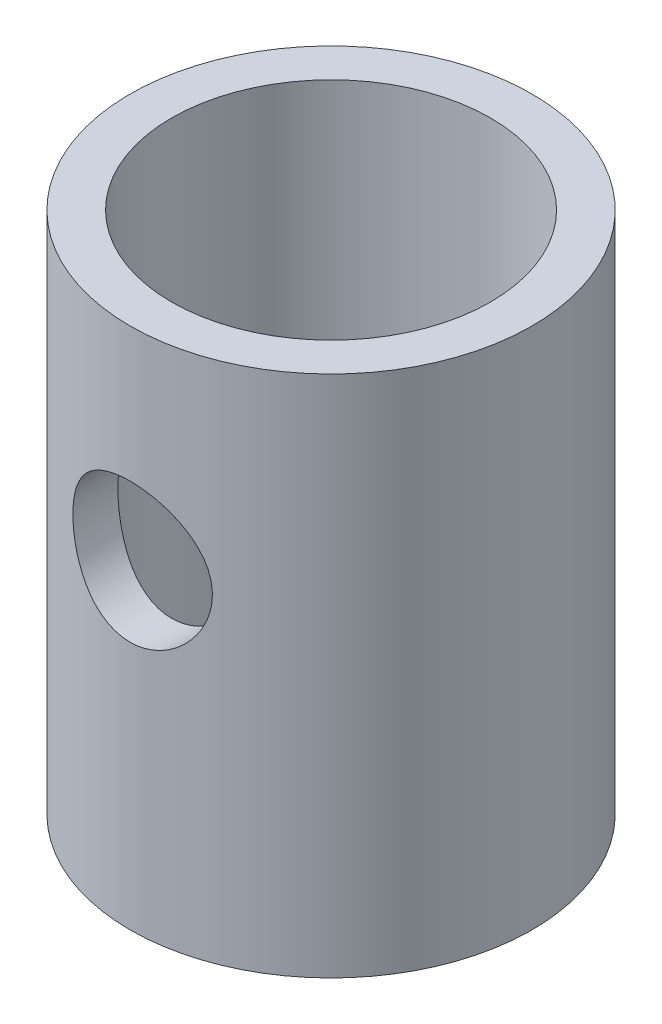
ISO-10303-21;
HEADER;
FILE_DESCRIPTION(('STEP AP214'),'2;1');
FILE_NAME('part.step','',(''),(''),'','','');
FILE_SCHEMA(('AUTOMOTIVE_DESIGN { 1 0 10303 214 1 1 1 1 }'));
ENDSEC;
DATA;
#1=APPLICATION_CONTEXT('core data for automotive mechanical design processes');
#2=APPLICATION_PROTOCOL_DEFINITION('international standard','automotive_design',2000,#1);
#3=PRODUCT_CONTEXT('',#1,'mechanical');
#4=PRODUCT('Part','Part','',(#3));
#5=PRODUCT_RELATED_PRODUCT_CATEGORY('part','',(#4));
#6=PRODUCT_DEFINITION_FORMATION('','',#4);
#7=PRODUCT_DEFINITION_CONTEXT('part definition',#1,'design');
#8=PRODUCT_DEFINITION('design','',#6,#7);
#9=PRODUCT_DEFINITION_SHAPE('','',#8);
#10=(LENGTH_UNIT() NAMED_UNIT(*) SI_UNIT(.MILLI.,.METRE.));
#11=(NAMED_UNIT(*) PLANE_ANGLE_UNIT() SI_UNIT($,.RADIAN.));
#12=(NAMED_UNIT(*) SI_UNIT($,.STERADIAN.) SOLID_ANGLE_UNIT());
#13=UNCERTAINTY_MEASURE_WITH_UNIT(LENGTH_MEASURE(1.E-05),#10,'distance_accuracy_value','');
#14=(GEOMETRIC_REPRESENTATION_CONTEXT(3) GLOBAL_UNCERTAINTY_ASSIGNED_CONTEXT((#13)) GLOBAL_UNIT_ASSIGNED_CONTEXT((#10,
#11,#12)) REPRESENTATION_CONTEXT('',''));
#15=CARTESIAN_POINT('',(0.,0.,0.));
#16=DIRECTION('',(0.,0.,1.));
#17=DIRECTION('',(1.,0.,0.));
#18=AXIS2_PLACEMENT_3D('',#15,#16,#17);
#19=CARTESIAN_POINT('',(0.,20.828,0.));
#20=DIRECTION('',(0.,1.,0.));
#21=DIRECTION('',(0.,0.,1.));
#22=AXIS2_PLACEMENT_3D('',#19,#20,#21);
#23=PLANE('',#22);
#24=CARTESIAN_POINT('',(0.,20.828,0.));
#25=DIRECTION('',(0.,1.,0.));
#26=DIRECTION('',(0.,0.,1.));
#27=AXIS2_PLACEMENT_3D('',#24,#25,#26);
#28=CIRCLE('',#27,8.001);
#29=CARTESIAN_POINT('',(0.,20.828,8.001));
#30=VERTEX_POINT('',#29);
#31=EDGE_CURVE('E12',#30,#30,#28,.T.);
#32=ORIENTED_EDGE('',*,*,#31,.T.);
#33=EDGE_LOOP('',(#32));
#34=FACE_BOUND('',#33,.T.);
#35=CARTESIAN_POINT('',(0.,20.828,0.));
#36=DIRECTION('',(0.,1.,0.));
#37=DIRECTION('',(0.,0.,1.));
#38=AXIS2_PLACEMENT_3D('',#35,#36,#37);
#39=CIRCLE('',#38,6.35);
#40=CARTESIAN_POINT('',(0.,20.828,6.35));
#41=VERTEX_POINT('',#40);
#42=EDGE_CURVE('E63',#41,#41,#39,.T.);
#43=ORIENTED_EDGE('',*,*,#42,.F.);
#44=EDGE_LOOP('',(#43));
#45=FACE_BOUND('',#44,.T.);
#46=ADVANCED_FACE('F45',(#34,#45),#23,.T.);
#47=CARTESIAN_POINT('',(0.,0.,0.));
#48=DIRECTION('',(0.,1.,0.));
#49=DIRECTION('',(0.,0.,1.));
#50=AXIS2_PLACEMENT_3D('',#47,#48,#49);
#51=PLANE('',#50);
#52=CARTESIAN_POINT('',(0.,0.,0.));
#53=DIRECTION('',(0.,1.,0.));
#54=DIRECTION('',(0.,0.,1.));
#55=AXIS2_PLACEMENT_3D('',#52,#53,#54);
#56=CIRCLE('',#55,8.001);
#57=CARTESIAN_POINT('',(0.,0.,8.001));
#58=VERTEX_POINT('',#57);
#59=EDGE_CURVE('E58',#58,#58,#56,.T.);
#60=ORIENTED_EDGE('',*,*,#59,.F.);
#61=EDGE_LOOP('',(#60));
#62=FACE_BOUND('',#61,.T.);
#63=CARTESIAN_POINT('',(0.,0.,0.));
#64=DIRECTION('',(0.,1.,0.));
#65=DIRECTION('',(0.,0.,1.));
#66=AXIS2_PLACEMENT_3D('',#63,#64,#65);
#67=CIRCLE('',#66,6.35);
#68=CARTESIAN_POINT('',(0.,0.,6.35));
#69=VERTEX_POINT('',#68);
#70=EDGE_CURVE('E65',#69,#69,#67,.T.);
#71=ORIENTED_EDGE('',*,*,#70,.T.);
#72=EDGE_LOOP('',(#71));
#73=FACE_BOUND('',#72,.T.);
#74=ADVANCED_FACE('F85',(#62,#73),#51,.F.);
#75=CARTESIAN_POINT('',(0.,20.828,0.));
#76=DIRECTION('',(0.,-1.,0.));
#77=DIRECTION('',(0.,0.,-1.));
#78=AXIS2_PLACEMENT_3D('',#75,#76,#77);
#79=CYLINDRICAL_SURFACE('',#78,8.001);
#80=CARTESIAN_POINT('',(2.77876,12.7,7.50296567114631));
#81=CARTESIAN_POINT('',(2.77876212863539,12.549059022471,7.50296389657498));
#82=CARTESIAN_POINT('',(2.76642003558003,12.3981328603388,7.5075702070208));
#83=CARTESIAN_POINT('',(2.7175626943319,12.1007778159867,7.52539149104492));
#84=CARTESIAN_POINT('',(2.6810451243575,11.9543493671349,7.53860729146559));
#85=CARTESIAN_POINT('',(2.5852951565136,11.6703510400628,7.57197390736818));
#86=CARTESIAN_POINT('',(2.52611039842604,11.5327632847795,7.59211016902121));
#87=CARTESIAN_POINT('',(2.38687097517846,11.2694217526699,7.63702697064032));
#88=CARTESIAN_POINT('',(2.30681111478616,11.1436709323454,7.66180866629354));
#89=CARTESIAN_POINT('',(2.12444775978158,10.9022261958283,7.71440543553159));
#90=CARTESIAN_POINT('',(2.0214045858259,10.7871082842002,7.74230069893931));
#91=CARTESIAN_POINT('',(1.79757523478949,10.5753898047312,7.79730666818172));
#92=CARTESIAN_POINT('',(1.67678593195421,10.4787925059835,7.82441723479302));
#93=CARTESIAN_POINT('',(1.41662934979774,10.3041923040121,7.87573557459727));
#94=CARTESIAN_POINT('',(1.27682954120934,10.2268002131398,7.89983815255547));
#95=CARTESIAN_POINT('',(0.985213131659621,10.0968633610155,7.94147388199872));
#96=CARTESIAN_POINT('',(0.833400080918614,10.0443112906793,7.95900896562897));
#97=CARTESIAN_POINT('',(0.528111330978504,9.96752098135245,7.98496560995782));
#98=CARTESIAN_POINT('',(0.374911711312878,9.94229442106042,7.9937044143121));
#99=CARTESIAN_POINT('',(0.0662212435110383,9.91772089710158,8.00221399416071));
#100=CARTESIAN_POINT('',(-0.0892689524623575,9.91836670427311,8.00198727476892));
#101=CARTESIAN_POINT('',(-0.391102956684875,9.94490922174468,7.99280210530326));
#102=CARTESIAN_POINT('',(-0.537554507985823,9.96973083051991,7.98421543014063));
#103=CARTESIAN_POINT('',(-0.824066996356055,10.0421326242364,7.95974865922028));
#104=CARTESIAN_POINT('',(-0.964127491195955,10.0897143814591,7.94386805959797));
#105=CARTESIAN_POINT('',(-1.23614284267697,10.2068707574686,7.90614198557191));
#106=CARTESIAN_POINT('',(-1.36796057926843,10.2767373750483,7.88421787265311));
#107=CARTESIAN_POINT('',(-1.61830707602438,10.4362343500376,7.83666662876341));
#108=CARTESIAN_POINT('',(-1.73683191309842,10.5258705189381,7.81103840969232));
#109=CARTESIAN_POINT('',(-1.96360692433919,10.7277048554603,7.75722388488318));
#110=CARTESIAN_POINT('',(-2.07102858533127,10.8408182700055,7.72897376698897));
#111=CARTESIAN_POINT('',(-2.26566084059581,11.0836740872239,7.67417944372543));
#112=CARTESIAN_POINT('',(-2.35286774012803,11.2134195230849,7.64763555085001));
#113=CARTESIAN_POINT('',(-2.50587740013897,11.4886867522508,7.5988919973985));
#114=CARTESIAN_POINT('',(-2.57129988370729,11.6344351226484,7.57677196712419));
#115=CARTESIAN_POINT('',(-2.67638092625534,11.9358450377868,7.5402995112186));
#116=CARTESIAN_POINT('',(-2.71605140202881,12.0915019606548,7.52594349328888));
#117=CARTESIAN_POINT('',(-2.76675213914958,12.4002282900116,7.50744836056379));
#118=CARTESIAN_POINT('',(-2.77907766052208,12.5530572869401,7.50284766415531));
#119=CARTESIAN_POINT('',(-2.77843003738575,12.8586364020602,7.5030882341987));
#120=CARTESIAN_POINT('',(-2.7654620074162,13.0113865299525,7.5079275918033));
#121=CARTESIAN_POINT('',(-2.71576306299798,13.3063461200688,7.52603991520172));
#122=CARTESIAN_POINT('',(-2.67996372211331,13.4487351067094,7.53898190993083));
#123=CARTESIAN_POINT('',(-2.58675355184134,13.7254457494719,7.57146789067085));
#124=CARTESIAN_POINT('',(-2.52933868983367,13.8597658948347,7.59101310851799));
#125=CARTESIAN_POINT('',(-2.3923339418058,14.1215499123709,7.6353175995827));
#126=CARTESIAN_POINT('',(-2.31206171669666,14.2486299680255,7.66023044157966));
#127=CARTESIAN_POINT('',(-2.13237838636147,14.4879821954156,7.71217848356268));
#128=CARTESIAN_POINT('',(-2.03296118205675,14.6002496289875,7.73921435826037));
#129=CARTESIAN_POINT('',(-1.81156710613403,14.8129401874223,7.79409302451528));
#130=CARTESIAN_POINT('',(-1.68867456398179,14.9124216432991,7.82190276357038));
#131=CARTESIAN_POINT('',(-1.42725355533765,15.0894280398298,7.87379715575659));
#132=CARTESIAN_POINT('',(-1.28872548756484,15.1669535402022,7.897881903841));
#133=CARTESIAN_POINT('',(-1.00049672840704,15.2971842122062,7.9395252909902));
#134=CARTESIAN_POINT('',(-0.850866093016549,15.3500318462177,7.95712126176772));
#135=CARTESIAN_POINT('',(-0.544102332625241,15.4295677355479,7.98395985371242));
#136=CARTESIAN_POINT('',(-0.386972201169217,15.4562663385898,7.99320577905578));
#137=CARTESIAN_POINT('',(-0.0782478360859416,15.4817534151245,8.00203216701422));
#138=CARTESIAN_POINT('',(0.0732230133873225,15.4818886738575,8.00207903022128));
#139=CARTESIAN_POINT('',(0.37392927634761,15.457613413975,7.99367224413965));
#140=CARTESIAN_POINT('',(0.523164896733083,15.4332051815959,7.98521938660355));
#141=CARTESIAN_POINT('',(0.812400419535031,15.3614496817474,7.96094866761162));
#142=CARTESIAN_POINT('',(0.952519983371858,15.3145343486015,7.94526969682297));
#143=CARTESIAN_POINT('',(1.22294079148731,15.1995050501196,7.90816445566002));
#144=CARTESIAN_POINT('',(1.35324021135037,15.1313871577091,7.88673712069251));
#145=CARTESIAN_POINT('',(1.60584523756447,14.9728528676057,7.83928723930165));
#146=CARTESIAN_POINT('',(1.72764411194743,14.8816734463466,7.81311858920086));
#147=CARTESIAN_POINT('',(1.95464569894471,14.6808702840873,7.75944528979499));
#148=CARTESIAN_POINT('',(2.05984286992704,14.5712404094713,7.73194019837719));
#149=CARTESIAN_POINT('',(2.25532594799463,14.3309573726194,7.67725647616264));
#150=CARTESIAN_POINT('',(2.34476435876245,14.19959724141,7.65014406997125));
#151=CARTESIAN_POINT('',(2.50026158652251,13.922856090322,7.60074861161155));
#152=CARTESIAN_POINT('',(2.56632395578108,13.7774772050353,7.57846482587683));
#153=CARTESIAN_POINT('',(2.67189332860254,13.4791637701792,7.54188846606034));
#154=CARTESIAN_POINT('',(2.71182633228712,13.3263964292559,7.52746837082996));
#155=CARTESIAN_POINT('',(2.7652528640181,13.0157458355809,7.5080099206605));
#156=CARTESIAN_POINT('',(2.77875777372164,12.8578648149056,7.50296752711929));
#157=CARTESIAN_POINT('',(2.77876,12.7,7.50296567114631));
#158=B_SPLINE_CURVE_WITH_KNOTS('',3,(#80,#81,#82,#83,#84,#85,#86,#87,#88,#89,#90,#91,#92,#93,
#94,#95,#96,#97,#98,#99,#100,#101,#102,#103,#104,#105,#106,#107,#108,#109,#110,#111,#112,#113,
#114,#115,#116,#117,#118,#119,#120,#121,#122,#123,#124,#125,#126,#127,#128,#129,#130,#131,#132,
#133,#134,#135,#136,#137,#138,#139,#140,#141,#142,#143,#144,#145,#146,#147,#148,#149,#150,#151,
#152,#153,#154,#155,#156,#157),.UNSPECIFIED.,.T.,.F.,(4,2,2,2,2,2,2,2,2,2,2,2,2,2,2,2,2,2,2,2,2,
2,2,2,2,2,2,2,2,2,2,2,2,2,2,2,2,2,4),(0.,0.452237275354751,0.904517989296236,1.35585331235259,
1.80730106760552,2.27618485464552,2.7451513288259,3.22753024247407,3.70976712941744,
4.17391115031731,4.63792548270855,5.08220505674032,5.52651532623993,5.97690464088239,
6.4274265296177,6.90084886477755,7.37435766129691,7.85574496923458,8.33690935512156,
8.79474649642942,9.25249106934883,9.69265905191249,10.1329091935264,10.5880016879361,
11.0432394032128,11.5225771284093,12.0019026328503,12.4784257553046,12.9547602312255,
13.4069375530072,13.8590727581817,14.3028584731562,14.7467264337541,15.2078266203897,
15.6690803977346,16.1503948229239,16.6316360752434,17.1048218274177,17.5778037501271),.UNSPECIFIED.);
#159=CARTESIAN_POINT('',(2.77876,12.7,7.50296567114631));
#160=VERTEX_POINT('',#159);
#161=EDGE_CURVE('E68',#160,#160,#158,.T.);
#162=ORIENTED_EDGE('',*,*,#161,.T.);
#163=EDGE_LOOP('',(#162));
#164=FACE_BOUND('',#163,.T.);
#165=ORIENTED_EDGE('',*,*,#31,.F.);
#166=EDGE_LOOP('',(#165));
#167=FACE_BOUND('',#166,.T.);
#168=ORIENTED_EDGE('',*,*,#59,.T.);
#169=EDGE_LOOP('',(#168));
#170=FACE_BOUND('',#169,.T.);
#171=ADVANCED_FACE('F47',(#164,#167,#170),#79,.T.);
#172=CARTESIAN_POINT('',(0.,20.828,0.));
#173=DIRECTION('',(0.,-1.,0.));
#174=DIRECTION('',(0.,0.,-1.));
#175=AXIS2_PLACEMENT_3D('',#172,#173,#174);
#176=CYLINDRICAL_SURFACE('',#175,6.35);
#177=CARTESIAN_POINT('',(2.77876,12.7,5.70972791491854));
#178=CARTESIAN_POINT('',(2.77875224448956,12.5525937244497,5.70973614061377));
#179=CARTESIAN_POINT('',(2.76695555305398,12.4049384441924,5.71551923519418));
#180=CARTESIAN_POINT('',(2.72027382863343,12.1139584333146,5.73787823174277));
#181=CARTESIAN_POINT('',(2.68532917590217,11.9706458871958,5.75448200158393));
#182=CARTESIAN_POINT('',(2.59400583312198,11.6930791190247,5.79621590470724));
#183=CARTESIAN_POINT('',(2.53772064353158,11.5587883484704,5.8213087932125));
#184=CARTESIAN_POINT('',(2.40559379738486,11.3015914275156,5.8771373591685));
#185=CARTESIAN_POINT('',(2.32975537169446,11.1786834008511,5.90787210414943));
#186=CARTESIAN_POINT('',(2.15509947405378,10.9392158202047,5.97388310422641));
#187=CARTESIAN_POINT('',(2.0551429288972,10.8235317516107,6.00932310072996));
#188=CARTESIAN_POINT('',(1.83747493438074,10.609913732322,6.07941240657773));
#189=CARTESIAN_POINT('',(1.71975625194709,10.5119870487,6.1140613871572));
#190=CARTESIAN_POINT('',(1.462871709305,10.3320320760589,6.18069018906804));
#191=CARTESIAN_POINT('',(1.32294043317952,10.2510106234339,6.21245776661494));
#192=CARTESIAN_POINT('',(1.02978989494337,10.1140426452924,6.26771290757276));
#193=CARTESIAN_POINT('',(0.876577152566678,10.0580838990188,6.29120450521624));
#194=CARTESIAN_POINT('',(0.570425852381852,9.97607074102917,6.32609564610197));
#195=CARTESIAN_POINT('',(0.417964309493011,9.94850065603736,6.33810528541421));
#196=CARTESIAN_POINT('',(0.110138561602235,9.91912770684776,6.3509099400935));
#197=CARTESIAN_POINT('',(-0.0452243048513163,9.91731324047653,6.35171000505279));
#198=CARTESIAN_POINT('',(-0.343336103218629,9.93875733373143,6.34234852456084));
#199=CARTESIAN_POINT('',(-0.486232734785837,9.9603441153319,6.33291782881511));
#200=CARTESIAN_POINT('',(-0.766135833493372,10.0250828155737,6.30518222507707));
#201=CARTESIAN_POINT('',(-0.903141863946118,10.068236330037,6.28687666039529));
#202=CARTESIAN_POINT('',(-1.16991379863095,10.1753624205239,6.24278594412865));
#203=CARTESIAN_POINT('',(-1.29953701133546,10.2396431634325,6.2168907333274));
#204=CARTESIAN_POINT('',(-1.54649798892067,10.3868766238671,6.16010748092585));
#205=CARTESIAN_POINT('',(-1.66383127627394,10.4698361120977,6.12921763000684));
#206=CARTESIAN_POINT('',(-1.89244152955748,10.6594412341217,6.06270597485088));
#207=CARTESIAN_POINT('',(-2.00256622852023,10.7674144078514,6.02690295104239));
#208=CARTESIAN_POINT('',(-2.20367536653032,11.0002915227595,5.95631580185228));
#209=CARTESIAN_POINT('',(-2.29465083714782,11.1252033522286,5.92153216042775));
#210=CARTESIAN_POINT('',(-2.45828085817013,11.394570162569,5.855549540643));
#211=CARTESIAN_POINT('',(-2.53007323578491,11.539600893491,5.82454557186948));
#212=CARTESIAN_POINT('',(-2.64773457031787,11.8414055582435,5.77201884357853));
#213=CARTESIAN_POINT('',(-2.6936242655911,11.9981699835488,5.75048850228454));
#214=CARTESIAN_POINT('',(-2.75508313767722,12.3074148966991,5.7212852001499));
#215=CARTESIAN_POINT('',(-2.77253425858667,12.4594385882305,5.71275481520696));
#216=CARTESIAN_POINT('',(-2.78219463022474,12.7644491152255,5.70805894561828));
#217=CARTESIAN_POINT('',(-2.77441422957701,12.9174355301418,5.71188839162642));
#218=CARTESIAN_POINT('',(-2.73555389652817,13.2080996088479,5.73058774716768));
#219=CARTESIAN_POINT('',(-2.70623578940978,13.3460738436924,5.74462204006049));
#220=CARTESIAN_POINT('',(-2.6275318538273,13.614999916155,5.78104161725882));
#221=CARTESIAN_POINT('',(-2.57814100076141,13.7459499861895,5.80342899238955));
#222=CARTESIAN_POINT('',(-2.45829206529129,14.003605086678,5.85523080225463));
#223=CARTESIAN_POINT('',(-2.38699870168025,14.1298660869426,5.88491227798489));
#224=CARTESIAN_POINT('',(-2.2261714205161,14.3692773416529,5.9476132942183));
#225=CARTESIAN_POINT('',(-2.13662907747993,14.4824215021123,5.98063437304285));
#226=CARTESIAN_POINT('',(-1.93220472135868,14.7031817138676,6.04993822389312));
#227=CARTESIAN_POINT('',(-1.81575352158577,14.8093438577808,6.08624289378158));
#228=CARTESIAN_POINT('',(-1.56589305242115,15.0009276756199,6.1552629958706));
#229=CARTESIAN_POINT('',(-1.43248170353288,15.086346802485,6.18797798701999));
#230=CARTESIAN_POINT('',(-1.15082342056645,15.2342795946124,6.24651175831843));
#231=CARTESIAN_POINT('',(-1.00248037443749,15.2966309633097,6.27228134150254));
#232=CARTESIAN_POINT('',(-0.695980236574464,15.3949907311717,6.31363267553883));
#233=CARTESIAN_POINT('',(-0.537829730190567,15.4310166035489,6.32922118321866));
#234=CARTESIAN_POINT('',(-0.229127170042997,15.4733411054776,6.34760496861872));
#235=CARTESIAN_POINT('',(-0.0789060749274237,15.4816834655969,6.35127928849059));
#236=CARTESIAN_POINT('',(0.22077507690588,15.474025466845,6.34792829283748));
#237=CARTESIAN_POINT('',(0.370235286172083,15.4580301970942,6.34090521419175));
#238=CARTESIAN_POINT('',(0.65763184190223,15.4036138279507,6.31743292578702));
#239=CARTESIAN_POINT('',(0.7957884761746,15.3661643512074,6.30139264365641));
#240=CARTESIAN_POINT('',(1.06376683329433,15.2710183461437,6.26173013923785));
#241=CARTESIAN_POINT('',(1.19358705732396,15.2133181889081,6.23810655809004));
#242=CARTESIAN_POINT('',(1.44778094383765,15.0763899881866,6.18418026119606));
#243=CARTESIAN_POINT('',(1.57163288992744,14.9962970505896,6.15362120845358));
#244=CARTESIAN_POINT('',(1.80468265612122,14.8180570238747,6.0893560991839));
#245=CARTESIAN_POINT('',(1.91387440581031,14.7199024955454,6.05564874876254));
#246=CARTESIAN_POINT('',(2.12316960094698,14.4995778379309,5.98562783081386));
#247=CARTESIAN_POINT('',(2.22194840535476,14.3761483188811,5.9493112021841));
#248=CARTESIAN_POINT('',(2.39768549345721,14.1133518252866,5.88069229254771));
#249=CARTESIAN_POINT('',(2.4746305869712,13.9739752878622,5.84839244474847));
#250=CARTESIAN_POINT('',(2.5716990695895,13.7555845876812,5.80604057638289));
#251=CARTESIAN_POINT('',(2.60102277569886,13.6811320425308,5.79292673729704));
#252=CARTESIAN_POINT('',(2.65323017105823,13.5296287183113,5.76920221766458));
#253=CARTESIAN_POINT('',(2.67611706582961,13.452579253989,5.75859029159675));
#254=CARTESIAN_POINT('',(2.71513056379588,13.2966714911446,5.74029874150733));
#255=CARTESIAN_POINT('',(2.73127494007584,13.217818533471,5.7326114131612));
#256=CARTESIAN_POINT('',(2.75667149901366,13.0588070664646,5.72044249762346));
#257=CARTESIAN_POINT('',(2.7659289045104,12.9786495936712,5.71595848125431));
#258=CARTESIAN_POINT('',(2.7740396177284,12.8652416852611,5.71202326369088));
#259=CARTESIAN_POINT('',(2.77580877171842,12.8322251917615,5.71116362172475));
#260=CARTESIAN_POINT('',(2.7781698460874,12.7661433124505,5.71001501808282));
#261=CARTESIAN_POINT('',(2.7787617403343,12.7330779255699,5.70972606907491));
#262=CARTESIAN_POINT('',(2.77876,12.7,5.70972791491854));
#263=B_SPLINE_CURVE_WITH_KNOTS('',3,(#177,#178,#179,#180,#181,#182,#183,#184,#185,#186,#187,
#188,#189,#190,#191,#192,#193,#194,#195,#196,#197,#198,#199,#200,#201,#202,#203,#204,#205,#206,
#207,#208,#209,#210,#211,#212,#213,#214,#215,#216,#217,#218,#219,#220,#221,#222,#223,#224,#225,
#226,#227,#228,#229,#230,#231,#232,#233,#234,#235,#236,#237,#238,#239,#240,#241,#242,#243,#244,
#245,#246,#247,#248,#249,#250,#251,#252,#253,#254,#255,#256,#257,#258,#259,#260,#261,#262),
.UNSPECIFIED.,.T.,.F.,(4,2,2,2,2,2,2,2,2,2,2,2,2,2,2,2,2,2,2,2,2,2,2,2,2,2,2,2,2,2,2,2,2,2,2,2,
2,2,2,2,2,2,4),(0.,0.442086859752782,0.885316806074602,1.32662683463384,1.76786399030523,
2.23664993270164,2.70562729127448,3.19744998355114,3.68903259773415,4.15274250439959,
4.61624351631201,5.04868939251146,5.48116727211342,5.9202562312042,6.35950460901045,
6.83239745026228,7.30551127774311,7.79724911748075,8.28859269876735,8.74586326251375,
9.20294630200091,9.62629765354287,10.0497550435638,10.4919445058847,10.9343385897566,
11.4172254608493,11.9001715962698,12.3864537109662,12.8724127682132,13.3215882446717,
13.7706698091971,14.2008611909368,14.6311297022243,15.0811032154073,15.5312624803044,
16.0156905741451,16.5004107006216,16.7433937916592,16.9862556623869,17.2284732528057,
17.4705069660605,17.569708927439,17.6689130908149),.UNSPECIFIED.);
#264=CARTESIAN_POINT('',(2.77876,12.7,5.70972791491854));
#265=VERTEX_POINT('',#264);
#266=EDGE_CURVE('E50',#265,#265,#263,.T.);
#267=ORIENTED_EDGE('',*,*,#266,.F.);
#268=EDGE_LOOP('',(#267));
#269=FACE_BOUND('',#268,.T.);
#270=ORIENTED_EDGE('',*,*,#42,.T.);
#271=EDGE_LOOP('',(#270));
#272=FACE_BOUND('',#271,.T.);
#273=ORIENTED_EDGE('',*,*,#70,.F.);
#274=EDGE_LOOP('',(#273));
#275=FACE_BOUND('',#274,.T.);
#276=ADVANCED_FACE('F77',(#269,#272,#275),#176,.F.);
#277=CARTESIAN_POINT('',(0.,12.7,1.651));
#278=DIRECTION('',(0.,0.,1.));
#279=DIRECTION('',(1.,0.,0.));
#280=AXIS2_PLACEMENT_3D('',#277,#278,#279);
#281=CYLINDRICAL_SURFACE('',#280,2.77876);
#282=ORIENTED_EDGE('',*,*,#266,.T.);
#283=EDGE_LOOP('',(#282));
#284=FACE_BOUND('',#283,.T.);
#285=ORIENTED_EDGE('',*,*,#161,.F.);
#286=EDGE_LOOP('',(#285));
#287=FACE_BOUND('',#286,.T.);
#288=ADVANCED_FACE('F74',(#284,#287),#281,.F.);
#289=CLOSED_SHELL('',(#46,#74,#171,#276,#288));
#290=MANIFOLD_SOLID_BREP('B2',#289);
#291=ADVANCED_BREP_SHAPE_REPRESENTATION('',(#18,#290),#14);
#292=SHAPE_DEFINITION_REPRESENTATION(#9,#291);
ENDSEC;
END-ISO-10303-21;
